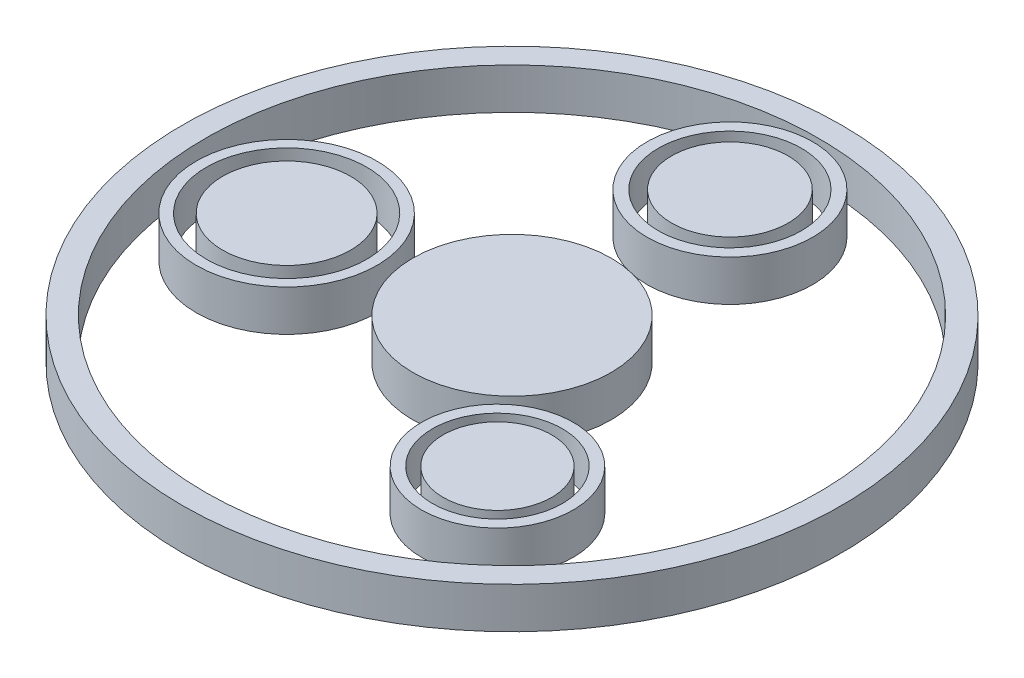
ISO-10303-21;
HEADER;
FILE_DESCRIPTION(('STEP AP214'),'2;1');
FILE_NAME('part.step','',(''),(''),'','','');
FILE_SCHEMA(('AUTOMOTIVE_DESIGN { 1 0 10303 214 1 1 1 1 }'));
ENDSEC;
DATA;
#1=APPLICATION_CONTEXT('core data for automotive mechanical design processes');
#2=APPLICATION_PROTOCOL_DEFINITION('international standard','automotive_design',2000,#1);
#3=PRODUCT_CONTEXT('',#1,'mechanical');
#4=PRODUCT('Part','Part','',(#3));
#5=PRODUCT_RELATED_PRODUCT_CATEGORY('part','',(#4));
#6=PRODUCT_DEFINITION_FORMATION('','',#4);
#7=PRODUCT_DEFINITION_CONTEXT('part definition',#1,'design');
#8=PRODUCT_DEFINITION('design','',#6,#7);
#9=PRODUCT_DEFINITION_SHAPE('','',#8);
#10=(LENGTH_UNIT() NAMED_UNIT(*) SI_UNIT(.MILLI.,.METRE.));
#11=(NAMED_UNIT(*) PLANE_ANGLE_UNIT() SI_UNIT($,.RADIAN.));
#12=(NAMED_UNIT(*) SI_UNIT($,.STERADIAN.) SOLID_ANGLE_UNIT());
#13=UNCERTAINTY_MEASURE_WITH_UNIT(LENGTH_MEASURE(1.E-05),#10,'distance_accuracy_value','');
#14=(GEOMETRIC_REPRESENTATION_CONTEXT(3) GLOBAL_UNCERTAINTY_ASSIGNED_CONTEXT((#13)) GLOBAL_UNIT_ASSIGNED_CONTEXT((#10,
#11,#12)) REPRESENTATION_CONTEXT('',''));
#15=CARTESIAN_POINT('',(0.,0.,0.));
#16=DIRECTION('',(0.,0.,1.));
#17=DIRECTION('',(1.,0.,0.));
#18=AXIS2_PLACEMENT_3D('',#15,#16,#17);
#19=CARTESIAN_POINT('',(30.0232822078429,10.,33.5714882869516));
#20=DIRECTION('',(0.,-1.,0.));
#21=DIRECTION('',(0.,0.,-1.));
#22=AXIS2_PLACEMENT_3D('',#19,#20,#21);
#23=CYLINDRICAL_SURFACE('',#22,15.8011499569246);
#24=CARTESIAN_POINT('',(30.0232822078429,10.,33.5714882869516));
#25=DIRECTION('',(0.,1.,0.));
#26=DIRECTION('',(0.,0.,1.));
#27=AXIS2_PLACEMENT_3D('',#24,#25,#26);
#28=CIRCLE('',#27,15.8011499569246);
#29=CARTESIAN_POINT('',(30.0232822078429,10.,49.3726382438762));
#30=VERTEX_POINT('',#29);
#31=EDGE_CURVE('E125',#30,#30,#28,.T.);
#32=ORIENTED_EDGE('',*,*,#31,.T.);
#33=EDGE_LOOP('',(#32));
#34=FACE_BOUND('',#33,.T.);
#35=CARTESIAN_POINT('',(30.0232822078429,0.,33.5714882869516));
#36=DIRECTION('',(0.,1.,0.));
#37=DIRECTION('',(0.,0.,1.));
#38=AXIS2_PLACEMENT_3D('',#35,#36,#37);
#39=CIRCLE('',#38,15.8011499569246);
#40=CARTESIAN_POINT('',(30.0232822078429,0.,49.3726382438762));
#41=VERTEX_POINT('',#40);
#42=EDGE_CURVE('E131',#41,#41,#39,.T.);
#43=ORIENTED_EDGE('',*,*,#42,.F.);
#44=EDGE_LOOP('',(#43));
#45=FACE_BOUND('',#44,.T.);
#46=ADVANCED_FACE('F118',(#34,#45),#23,.F.);
#47=CARTESIAN_POINT('',(30.0232822078429,10.,33.5714882869516));
#48=DIRECTION('',(0.,-1.,0.));
#49=DIRECTION('',(0.,0.,-1.));
#50=AXIS2_PLACEMENT_3D('',#47,#48,#49);
#51=CYLINDRICAL_SURFACE('',#50,18.477604897057);
#52=CARTESIAN_POINT('',(30.0232822078429,10.,33.5714882869516));
#53=DIRECTION('',(0.,1.,0.));
#54=DIRECTION('',(0.,0.,1.));
#55=AXIS2_PLACEMENT_3D('',#52,#53,#54);
#56=CIRCLE('',#55,18.477604897057);
#57=CARTESIAN_POINT('',(30.0232822078429,10.,52.0490931840086));
#58=VERTEX_POINT('',#57);
#59=EDGE_CURVE('E12',#58,#58,#56,.T.);
#60=ORIENTED_EDGE('',*,*,#59,.F.);
#61=EDGE_LOOP('',(#60));
#62=FACE_BOUND('',#61,.T.);
#63=CARTESIAN_POINT('',(30.0232822078429,0.,33.5714882869516));
#64=DIRECTION('',(0.,1.,0.));
#65=DIRECTION('',(0.,0.,1.));
#66=AXIS2_PLACEMENT_3D('',#63,#64,#65);
#67=CIRCLE('',#66,18.477604897057);
#68=CARTESIAN_POINT('',(30.0232822078429,0.,52.0490931840086));
#69=VERTEX_POINT('',#68);
#70=EDGE_CURVE('E121',#69,#69,#67,.T.);
#71=ORIENTED_EDGE('',*,*,#70,.T.);
#72=EDGE_LOOP('',(#71));
#73=FACE_BOUND('',#72,.T.);
#74=ADVANCED_FACE('F138',(#62,#73),#51,.T.);
#75=CARTESIAN_POINT('',(0.,10.,0.));
#76=DIRECTION('',(0.,1.,0.));
#77=DIRECTION('',(0.,0.,1.));
#78=AXIS2_PLACEMENT_3D('',#75,#76,#77);
#79=PLANE('',#78);
#80=ORIENTED_EDGE('',*,*,#31,.F.);
#81=EDGE_LOOP('',(#80));
#82=FACE_BOUND('',#81,.T.);
#83=ORIENTED_EDGE('',*,*,#59,.T.);
#84=EDGE_LOOP('',(#83));
#85=FACE_BOUND('',#84,.T.);
#86=ADVANCED_FACE('F142',(#82,#85),#79,.T.);
#87=CARTESIAN_POINT('',(0.,0.,0.));
#88=DIRECTION('',(0.,1.,0.));
#89=DIRECTION('',(0.,0.,1.));
#90=AXIS2_PLACEMENT_3D('',#87,#88,#89);
#91=PLANE('',#90);
#92=ORIENTED_EDGE('',*,*,#42,.T.);
#93=EDGE_LOOP('',(#92));
#94=FACE_BOUND('',#93,.T.);
#95=ORIENTED_EDGE('',*,*,#70,.F.);
#96=EDGE_LOOP('',(#95));
#97=FACE_BOUND('',#96,.T.);
#98=ADVANCED_FACE('F140',(#94,#97),#91,.F.);
#99=CLOSED_SHELL('',(#46,#74,#86,#98));
#100=MANIFOLD_SOLID_BREP('B2',#99);
#101=CARTESIAN_POINT('',(30.0232822078429,10.,33.5714882869516));
#102=DIRECTION('',(0.,-1.,0.));
#103=DIRECTION('',(0.,0.,-1.));
#104=AXIS2_PLACEMENT_3D('',#101,#102,#103);
#105=CYLINDRICAL_SURFACE('',#104,13.2030239787019);
#106=CARTESIAN_POINT('',(30.0232822078429,10.,33.5714882869516));
#107=DIRECTION('',(0.,1.,0.));
#108=DIRECTION('',(0.,0.,1.));
#109=AXIS2_PLACEMENT_3D('',#106,#107,#108);
#110=CIRCLE('',#109,13.2030239787019);
#111=CARTESIAN_POINT('',(30.0232822078429,10.,46.7745122656536));
#112=VERTEX_POINT('',#111);
#113=EDGE_CURVE('E117',#112,#112,#110,.T.);
#114=ORIENTED_EDGE('',*,*,#113,.F.);
#115=EDGE_LOOP('',(#114));
#116=FACE_BOUND('',#115,.T.);
#117=CARTESIAN_POINT('',(30.0232822078429,0.,33.5714882869516));
#118=DIRECTION('',(0.,1.,0.));
#119=DIRECTION('',(0.,0.,1.));
#120=AXIS2_PLACEMENT_3D('',#117,#118,#119);
#121=CIRCLE('',#120,13.2030239787019);
#122=CARTESIAN_POINT('',(30.0232822078429,0.,46.7745122656536));
#123=VERTEX_POINT('',#122);
#124=EDGE_CURVE('E191',#123,#123,#121,.T.);
#125=ORIENTED_EDGE('',*,*,#124,.T.);
#126=EDGE_LOOP('',(#125));
#127=FACE_BOUND('',#126,.T.);
#128=ADVANCED_FACE('F188',(#116,#127),#105,.T.);
#129=CARTESIAN_POINT('',(0.,10.,0.));
#130=DIRECTION('',(0.,1.,0.));
#131=DIRECTION('',(0.,0.,1.));
#132=AXIS2_PLACEMENT_3D('',#129,#130,#131);
#133=PLANE('',#132);
#134=ORIENTED_EDGE('',*,*,#113,.T.);
#135=EDGE_LOOP('',(#134));
#136=FACE_BOUND('',#135,.T.);
#137=ADVANCED_FACE('F203',(#136),#133,.T.);
#138=CARTESIAN_POINT('',(0.,0.,0.));
#139=DIRECTION('',(0.,1.,0.));
#140=DIRECTION('',(0.,0.,1.));
#141=AXIS2_PLACEMENT_3D('',#138,#139,#140);
#142=PLANE('',#141);
#143=ORIENTED_EDGE('',*,*,#124,.F.);
#144=EDGE_LOOP('',(#143));
#145=FACE_BOUND('',#144,.T.);
#146=ADVANCED_FACE('F201',(#145),#142,.F.);
#147=CLOSED_SHELL('',(#128,#137,#146));
#148=MANIFOLD_SOLID_BREP('B7',#147);
#149=CARTESIAN_POINT('',(0.,10.,-53.0411319005225));
#150=DIRECTION('',(0.,-1.,0.));
#151=DIRECTION('',(0.,0.,-1.));
#152=AXIS2_PLACEMENT_3D('',#149,#150,#151);
#153=CYLINDRICAL_SURFACE('',#152,17.4158897125243);
#154=CARTESIAN_POINT('',(0.,10.,-53.0411319005225));
#155=DIRECTION('',(0.,1.,0.));
#156=DIRECTION('',(0.,0.,1.));
#157=AXIS2_PLACEMENT_3D('',#154,#155,#156);
#158=CIRCLE('',#157,17.4158897125243);
#159=CARTESIAN_POINT('',(0.,10.,-35.6252421879982));
#160=VERTEX_POINT('',#159);
#161=EDGE_CURVE('E244',#160,#160,#158,.T.);
#162=ORIENTED_EDGE('',*,*,#161,.T.);
#163=EDGE_LOOP('',(#162));
#164=FACE_BOUND('',#163,.T.);
#165=CARTESIAN_POINT('',(0.,0.,-53.0411319005225));
#166=DIRECTION('',(0.,1.,0.));
#167=DIRECTION('',(0.,0.,1.));
#168=AXIS2_PLACEMENT_3D('',#165,#166,#167);
#169=CIRCLE('',#168,17.4158897125243);
#170=CARTESIAN_POINT('',(0.,0.,-35.6252421879982));
#171=VERTEX_POINT('',#170);
#172=EDGE_CURVE('E250',#171,#171,#169,.T.);
#173=ORIENTED_EDGE('',*,*,#172,.F.);
#174=EDGE_LOOP('',(#173));
#175=FACE_BOUND('',#174,.T.);
#176=ADVANCED_FACE('F237',(#164,#175),#153,.F.);
#177=CARTESIAN_POINT('',(0.,10.,-53.0411319005225));
#178=DIRECTION('',(0.,-1.,0.));
#179=DIRECTION('',(0.,0.,-1.));
#180=AXIS2_PLACEMENT_3D('',#177,#178,#179);
#181=CYLINDRICAL_SURFACE('',#180,20.1523503336674);
#182=CARTESIAN_POINT('',(0.,10.,-53.0411319005225));
#183=DIRECTION('',(0.,1.,0.));
#184=DIRECTION('',(0.,0.,1.));
#185=AXIS2_PLACEMENT_3D('',#182,#183,#184);
#186=CIRCLE('',#185,20.1523503336674);
#187=CARTESIAN_POINT('',(0.,10.,-32.8887815668551));
#188=VERTEX_POINT('',#187);
#189=EDGE_CURVE('E187',#188,#188,#186,.T.);
#190=ORIENTED_EDGE('',*,*,#189,.F.);
#191=EDGE_LOOP('',(#190));
#192=FACE_BOUND('',#191,.T.);
#193=CARTESIAN_POINT('',(0.,0.,-53.0411319005225));
#194=DIRECTION('',(0.,1.,0.));
#195=DIRECTION('',(0.,0.,1.));
#196=AXIS2_PLACEMENT_3D('',#193,#194,#195);
#197=CIRCLE('',#196,20.1523503336674);
#198=CARTESIAN_POINT('',(0.,0.,-32.8887815668551));
#199=VERTEX_POINT('',#198);
#200=EDGE_CURVE('E240',#199,#199,#197,.T.);
#201=ORIENTED_EDGE('',*,*,#200,.T.);
#202=EDGE_LOOP('',(#201));
#203=FACE_BOUND('',#202,.T.);
#204=ADVANCED_FACE('F257',(#192,#203),#181,.T.);
#205=CARTESIAN_POINT('',(0.,10.,0.));
#206=DIRECTION('',(0.,1.,0.));
#207=DIRECTION('',(0.,0.,1.));
#208=AXIS2_PLACEMENT_3D('',#205,#206,#207);
#209=PLANE('',#208);
#210=ORIENTED_EDGE('',*,*,#161,.F.);
#211=EDGE_LOOP('',(#210));
#212=FACE_BOUND('',#211,.T.);
#213=ORIENTED_EDGE('',*,*,#189,.T.);
#214=EDGE_LOOP('',(#213));
#215=FACE_BOUND('',#214,.T.);
#216=ADVANCED_FACE('F261',(#212,#215),#209,.T.);
#217=CARTESIAN_POINT('',(0.,0.,0.));
#218=DIRECTION('',(0.,1.,0.));
#219=DIRECTION('',(0.,0.,1.));
#220=AXIS2_PLACEMENT_3D('',#217,#218,#219);
#221=PLANE('',#220);
#222=ORIENTED_EDGE('',*,*,#172,.T.);
#223=EDGE_LOOP('',(#222));
#224=FACE_BOUND('',#223,.T.);
#225=ORIENTED_EDGE('',*,*,#200,.F.);
#226=EDGE_LOOP('',(#225));
#227=FACE_BOUND('',#226,.T.);
#228=ADVANCED_FACE('F259',(#224,#227),#221,.F.);
#229=CLOSED_SHELL('',(#176,#204,#216,#228));
#230=MANIFOLD_SOLID_BREP('B112',#229);
#231=CARTESIAN_POINT('',(0.,10.,-53.0411319005225));
#232=DIRECTION('',(0.,-1.,0.));
#233=DIRECTION('',(0.,0.,-1.));
#234=AXIS2_PLACEMENT_3D('',#231,#232,#233);
#235=CYLINDRICAL_SURFACE('',#234,14.1811554627673);
#236=CARTESIAN_POINT('',(0.,10.,-53.0411319005225));
#237=DIRECTION('',(0.,1.,0.));
#238=DIRECTION('',(0.,0.,1.));
#239=AXIS2_PLACEMENT_3D('',#236,#237,#238);
#240=CIRCLE('',#239,14.1811554627673);
#241=CARTESIAN_POINT('',(0.,10.,-38.8599764377552));
#242=VERTEX_POINT('',#241);
#243=EDGE_CURVE('E236',#242,#242,#240,.T.);
#244=ORIENTED_EDGE('',*,*,#243,.F.);
#245=EDGE_LOOP('',(#244));
#246=FACE_BOUND('',#245,.T.);
#247=CARTESIAN_POINT('',(0.,0.,-53.0411319005225));
#248=DIRECTION('',(0.,1.,0.));
#249=DIRECTION('',(0.,0.,1.));
#250=AXIS2_PLACEMENT_3D('',#247,#248,#249);
#251=CIRCLE('',#250,14.1811554627673);
#252=CARTESIAN_POINT('',(0.,0.,-38.8599764377552));
#253=VERTEX_POINT('',#252);
#254=EDGE_CURVE('E310',#253,#253,#251,.T.);
#255=ORIENTED_EDGE('',*,*,#254,.T.);
#256=EDGE_LOOP('',(#255));
#257=FACE_BOUND('',#256,.T.);
#258=ADVANCED_FACE('F307',(#246,#257),#235,.T.);
#259=CARTESIAN_POINT('',(0.,10.,0.));
#260=DIRECTION('',(0.,1.,0.));
#261=DIRECTION('',(0.,0.,1.));
#262=AXIS2_PLACEMENT_3D('',#259,#260,#261);
#263=PLANE('',#262);
#264=ORIENTED_EDGE('',*,*,#243,.T.);
#265=EDGE_LOOP('',(#264));
#266=FACE_BOUND('',#265,.T.);
#267=ADVANCED_FACE('F322',(#266),#263,.T.);
#268=CARTESIAN_POINT('',(0.,0.,0.));
#269=DIRECTION('',(0.,1.,0.));
#270=DIRECTION('',(0.,0.,1.));
#271=AXIS2_PLACEMENT_3D('',#268,#269,#270);
#272=PLANE('',#271);
#273=ORIENTED_EDGE('',*,*,#254,.F.);
#274=EDGE_LOOP('',(#273));
#275=FACE_BOUND('',#274,.T.);
#276=ADVANCED_FACE('F320',(#275),#272,.F.);
#277=CLOSED_SHELL('',(#258,#267,#276));
#278=MANIFOLD_SOLID_BREP('B182',#277);
#279=CARTESIAN_POINT('',(-48.9470479630894,10.,5.91367679851451));
#280=DIRECTION('',(0.,-1.,0.));
#281=DIRECTION('',(0.,0.,-1.));
#282=AXIS2_PLACEMENT_3D('',#279,#280,#281);
#283=CYLINDRICAL_SURFACE('',#282,19.4798442658321);
#284=CARTESIAN_POINT('',(-48.9470479630894,10.,5.91367679851451));
#285=DIRECTION('',(0.,1.,0.));
#286=DIRECTION('',(0.,0.,1.));
#287=AXIS2_PLACEMENT_3D('',#284,#285,#286);
#288=CIRCLE('',#287,19.4798442658321);
#289=CARTESIAN_POINT('',(-48.9470479630894,10.,25.3935210643466));
#290=VERTEX_POINT('',#289);
#291=EDGE_CURVE('E363',#290,#290,#288,.T.);
#292=ORIENTED_EDGE('',*,*,#291,.T.);
#293=EDGE_LOOP('',(#292));
#294=FACE_BOUND('',#293,.T.);
#295=CARTESIAN_POINT('',(-48.9470479630894,0.,5.91367679851451));
#296=DIRECTION('',(0.,1.,0.));
#297=DIRECTION('',(0.,0.,1.));
#298=AXIS2_PLACEMENT_3D('',#295,#296,#297);
#299=CIRCLE('',#298,19.4798442658321);
#300=CARTESIAN_POINT('',(-48.9470479630894,0.,25.3935210643466));
#301=VERTEX_POINT('',#300);
#302=EDGE_CURVE('E369',#301,#301,#299,.T.);
#303=ORIENTED_EDGE('',*,*,#302,.F.);
#304=EDGE_LOOP('',(#303));
#305=FACE_BOUND('',#304,.T.);
#306=ADVANCED_FACE('F356',(#294,#305),#283,.F.);
#307=CARTESIAN_POINT('',(-48.9470479630894,10.,5.91367679851451));
#308=DIRECTION('',(0.,-1.,0.));
#309=DIRECTION('',(0.,0.,-1.));
#310=AXIS2_PLACEMENT_3D('',#307,#308,#309);
#311=CYLINDRICAL_SURFACE('',#310,22.0020305224809);
#312=CARTESIAN_POINT('',(-48.9470479630894,10.,5.91367679851451));
#313=DIRECTION('',(0.,1.,0.));
#314=DIRECTION('',(0.,0.,1.));
#315=AXIS2_PLACEMENT_3D('',#312,#313,#314);
#316=CIRCLE('',#315,22.0020305224809);
#317=CARTESIAN_POINT('',(-48.9470479630894,10.,27.9157073209954));
#318=VERTEX_POINT('',#317);
#319=EDGE_CURVE('E306',#318,#318,#316,.T.);
#320=ORIENTED_EDGE('',*,*,#319,.F.);
#321=EDGE_LOOP('',(#320));
#322=FACE_BOUND('',#321,.T.);
#323=CARTESIAN_POINT('',(-48.9470479630894,0.,5.91367679851451));
#324=DIRECTION('',(0.,1.,0.));
#325=DIRECTION('',(0.,0.,1.));
#326=AXIS2_PLACEMENT_3D('',#323,#324,#325);
#327=CIRCLE('',#326,22.0020305224809);
#328=CARTESIAN_POINT('',(-48.9470479630894,0.,27.9157073209954));
#329=VERTEX_POINT('',#328);
#330=EDGE_CURVE('E359',#329,#329,#327,.T.);
#331=ORIENTED_EDGE('',*,*,#330,.T.);
#332=EDGE_LOOP('',(#331));
#333=FACE_BOUND('',#332,.T.);
#334=ADVANCED_FACE('F376',(#322,#333),#311,.T.);
#335=CARTESIAN_POINT('',(0.,10.,0.));
#336=DIRECTION('',(0.,1.,0.));
#337=DIRECTION('',(0.,0.,1.));
#338=AXIS2_PLACEMENT_3D('',#335,#336,#337);
#339=PLANE('',#338);
#340=ORIENTED_EDGE('',*,*,#291,.F.);
#341=EDGE_LOOP('',(#340));
#342=FACE_BOUND('',#341,.T.);
#343=ORIENTED_EDGE('',*,*,#319,.T.);
#344=EDGE_LOOP('',(#343));
#345=FACE_BOUND('',#344,.T.);
#346=ADVANCED_FACE('F380',(#342,#345),#339,.T.);
#347=CARTESIAN_POINT('',(0.,0.,0.));
#348=DIRECTION('',(0.,1.,0.));
#349=DIRECTION('',(0.,0.,1.));
#350=AXIS2_PLACEMENT_3D('',#347,#348,#349);
#351=PLANE('',#350);
#352=ORIENTED_EDGE('',*,*,#302,.T.);
#353=EDGE_LOOP('',(#352));
#354=FACE_BOUND('',#353,.T.);
#355=ORIENTED_EDGE('',*,*,#330,.F.);
#356=EDGE_LOOP('',(#355));
#357=FACE_BOUND('',#356,.T.);
#358=ADVANCED_FACE('F378',(#354,#357),#351,.F.);
#359=CLOSED_SHELL('',(#306,#334,#346,#358));
#360=MANIFOLD_SOLID_BREP('B231',#359);
#361=CARTESIAN_POINT('',(-48.9470479630894,10.,5.91367679851451));
#362=DIRECTION('',(0.,-1.,0.));
#363=DIRECTION('',(0.,0.,-1.));
#364=AXIS2_PLACEMENT_3D('',#361,#362,#363);
#365=CYLINDRICAL_SURFACE('',#364,15.5763950976343);
#366=CARTESIAN_POINT('',(-48.9470479630894,10.,5.91367679851451));
#367=DIRECTION('',(0.,1.,0.));
#368=DIRECTION('',(0.,0.,1.));
#369=AXIS2_PLACEMENT_3D('',#366,#367,#368);
#370=CIRCLE('',#369,15.5763950976343);
#371=CARTESIAN_POINT('',(-48.9470479630894,10.,21.4900718961488));
#372=VERTEX_POINT('',#371);
#373=EDGE_CURVE('E355',#372,#372,#370,.T.);
#374=ORIENTED_EDGE('',*,*,#373,.F.);
#375=EDGE_LOOP('',(#374));
#376=FACE_BOUND('',#375,.T.);
#377=CARTESIAN_POINT('',(-48.9470479630894,0.,5.91367679851451));
#378=DIRECTION('',(0.,1.,0.));
#379=DIRECTION('',(0.,0.,1.));
#380=AXIS2_PLACEMENT_3D('',#377,#378,#379);
#381=CIRCLE('',#380,15.5763950976343);
#382=CARTESIAN_POINT('',(-48.9470479630894,0.,21.4900718961488));
#383=VERTEX_POINT('',#382);
#384=EDGE_CURVE('E429',#383,#383,#381,.T.);
#385=ORIENTED_EDGE('',*,*,#384,.T.);
#386=EDGE_LOOP('',(#385));
#387=FACE_BOUND('',#386,.T.);
#388=ADVANCED_FACE('F426',(#376,#387),#365,.T.);
#389=CARTESIAN_POINT('',(0.,10.,0.));
#390=DIRECTION('',(0.,1.,0.));
#391=DIRECTION('',(0.,0.,1.));
#392=AXIS2_PLACEMENT_3D('',#389,#390,#391);
#393=PLANE('',#392);
#394=ORIENTED_EDGE('',*,*,#373,.T.);
#395=EDGE_LOOP('',(#394));
#396=FACE_BOUND('',#395,.T.);
#397=ADVANCED_FACE('F441',(#396),#393,.T.);
#398=CARTESIAN_POINT('',(0.,0.,0.));
#399=DIRECTION('',(0.,1.,0.));
#400=DIRECTION('',(0.,0.,1.));
#401=AXIS2_PLACEMENT_3D('',#398,#399,#400);
#402=PLANE('',#401);
#403=ORIENTED_EDGE('',*,*,#384,.F.);
#404=EDGE_LOOP('',(#403));
#405=FACE_BOUND('',#404,.T.);
#406=ADVANCED_FACE('F439',(#405),#402,.F.);
#407=CLOSED_SHELL('',(#388,#397,#406));
#408=MANIFOLD_SOLID_BREP('B301',#407);
#409=CARTESIAN_POINT('',(0.,10.,0.));
#410=DIRECTION('',(0.,-1.,0.));
#411=DIRECTION('',(0.,0.,-1.));
#412=AXIS2_PLACEMENT_3D('',#409,#410,#411);
#413=CYLINDRICAL_SURFACE('',#412,24.1349976739206);
#414=CARTESIAN_POINT('',(0.,10.,0.));
#415=DIRECTION('',(0.,1.,0.));
#416=DIRECTION('',(0.,0.,1.));
#417=AXIS2_PLACEMENT_3D('',#414,#415,#416);
#418=CIRCLE('',#417,24.1349976739206);
#419=CARTESIAN_POINT('',(0.,10.,24.1349976739206));
#420=VERTEX_POINT('',#419);
#421=EDGE_CURVE('E425',#420,#420,#418,.T.);
#422=ORIENTED_EDGE('',*,*,#421,.F.);
#423=EDGE_LOOP('',(#422));
#424=FACE_BOUND('',#423,.T.);
#425=CARTESIAN_POINT('',(0.,0.,0.));
#426=DIRECTION('',(0.,1.,0.));
#427=DIRECTION('',(0.,0.,1.));
#428=AXIS2_PLACEMENT_3D('',#425,#426,#427);
#429=CIRCLE('',#428,24.1349976739206);
#430=CARTESIAN_POINT('',(0.,0.,24.1349976739206));
#431=VERTEX_POINT('',#430);
#432=EDGE_CURVE('E477',#431,#431,#429,.T.);
#433=ORIENTED_EDGE('',*,*,#432,.T.);
#434=EDGE_LOOP('',(#433));
#435=FACE_BOUND('',#434,.T.);
#436=ADVANCED_FACE('F474',(#424,#435),#413,.T.);
#437=CARTESIAN_POINT('',(0.,10.,0.));
#438=DIRECTION('',(0.,1.,0.));
#439=DIRECTION('',(0.,0.,1.));
#440=AXIS2_PLACEMENT_3D('',#437,#438,#439);
#441=PLANE('',#440);
#442=ORIENTED_EDGE('',*,*,#421,.T.);
#443=EDGE_LOOP('',(#442));
#444=FACE_BOUND('',#443,.T.);
#445=ADVANCED_FACE('F489',(#444),#441,.T.);
#446=CARTESIAN_POINT('',(0.,0.,0.));
#447=DIRECTION('',(0.,1.,0.));
#448=DIRECTION('',(0.,0.,1.));
#449=AXIS2_PLACEMENT_3D('',#446,#447,#448);
#450=PLANE('',#449);
#451=ORIENTED_EDGE('',*,*,#432,.F.);
#452=EDGE_LOOP('',(#451));
#453=FACE_BOUND('',#452,.T.);
#454=ADVANCED_FACE('F487',(#453),#450,.F.);
#455=CLOSED_SHELL('',(#436,#445,#454));
#456=MANIFOLD_SOLID_BREP('B350',#455);
#457=CARTESIAN_POINT('',(0.,10.,0.));
#458=DIRECTION('',(0.,-1.,0.));
#459=DIRECTION('',(0.,0.,-1.));
#460=AXIS2_PLACEMENT_3D('',#457,#458,#459);
#461=CYLINDRICAL_SURFACE('',#460,74.6426289945602);
#462=CARTESIAN_POINT('',(0.,10.,0.));
#463=DIRECTION('',(0.,1.,0.));
#464=DIRECTION('',(0.,0.,1.));
#465=AXIS2_PLACEMENT_3D('',#462,#463,#464);
#466=CIRCLE('',#465,74.6426289945602);
#467=CARTESIAN_POINT('',(0.,10.,74.6426289945602));
#468=VERTEX_POINT('',#467);
#469=EDGE_CURVE('E523',#468,#468,#466,.T.);
#470=ORIENTED_EDGE('',*,*,#469,.T.);
#471=EDGE_LOOP('',(#470));
#472=FACE_BOUND('',#471,.T.);
#473=CARTESIAN_POINT('',(0.,0.,0.));
#474=DIRECTION('',(0.,1.,0.));
#475=DIRECTION('',(0.,0.,1.));
#476=AXIS2_PLACEMENT_3D('',#473,#474,#475);
#477=CIRCLE('',#476,74.6426289945602);
#478=CARTESIAN_POINT('',(0.,0.,74.6426289945602));
#479=VERTEX_POINT('',#478);
#480=EDGE_CURVE('E530',#479,#479,#477,.T.);
#481=ORIENTED_EDGE('',*,*,#480,.F.);
#482=EDGE_LOOP('',(#481));
#483=FACE_BOUND('',#482,.T.);
#484=ADVANCED_FACE('F515',(#472,#483),#461,.F.);
#485=CARTESIAN_POINT('',(0.,10.,0.));
#486=DIRECTION('',(0.,-1.,0.));
#487=DIRECTION('',(0.,0.,-1.));
#488=AXIS2_PLACEMENT_3D('',#485,#486,#487);
#489=CYLINDRICAL_SURFACE('',#488,80.2226383773634);
#490=CARTESIAN_POINT('',(0.,10.,0.));
#491=DIRECTION('',(0.,1.,0.));
#492=DIRECTION('',(0.,0.,1.));
#493=AXIS2_PLACEMENT_3D('',#490,#491,#492);
#494=CIRCLE('',#493,80.2226383773634);
#495=CARTESIAN_POINT('',(0.,10.,80.2226383773634));
#496=VERTEX_POINT('',#495);
#497=EDGE_CURVE('E473',#496,#496,#494,.T.);
#498=ORIENTED_EDGE('',*,*,#497,.F.);
#499=EDGE_LOOP('',(#498));
#500=FACE_BOUND('',#499,.T.);
#501=CARTESIAN_POINT('',(0.,0.,0.));
#502=DIRECTION('',(0.,1.,0.));
#503=DIRECTION('',(0.,0.,1.));
#504=AXIS2_PLACEMENT_3D('',#501,#502,#503);
#505=CIRCLE('',#504,80.2226383773634);
#506=CARTESIAN_POINT('',(0.,0.,80.2226383773634));
#507=VERTEX_POINT('',#506);
#508=EDGE_CURVE('E518',#507,#507,#505,.T.);
#509=ORIENTED_EDGE('',*,*,#508,.T.);
#510=EDGE_LOOP('',(#509));
#511=FACE_BOUND('',#510,.T.);
#512=ADVANCED_FACE('F539',(#500,#511),#489,.T.);
#513=CARTESIAN_POINT('',(0.,10.,0.));
#514=DIRECTION('',(0.,1.,0.));
#515=DIRECTION('',(0.,0.,1.));
#516=AXIS2_PLACEMENT_3D('',#513,#514,#515);
#517=PLANE('',#516);
#518=ORIENTED_EDGE('',*,*,#469,.F.);
#519=EDGE_LOOP('',(#518));
#520=FACE_BOUND('',#519,.T.);
#521=ORIENTED_EDGE('',*,*,#497,.T.);
#522=EDGE_LOOP('',(#521));
#523=FACE_BOUND('',#522,.T.);
#524=ADVANCED_FACE('F543',(#520,#523),#517,.T.);
#525=CARTESIAN_POINT('',(0.,0.,0.));
#526=DIRECTION('',(0.,1.,0.));
#527=DIRECTION('',(0.,0.,1.));
#528=AXIS2_PLACEMENT_3D('',#525,#526,#527);
#529=PLANE('',#528);
#530=ORIENTED_EDGE('',*,*,#480,.T.);
#531=EDGE_LOOP('',(#530));
#532=FACE_BOUND('',#531,.T.);
#533=ORIENTED_EDGE('',*,*,#508,.F.);
#534=EDGE_LOOP('',(#533));
#535=FACE_BOUND('',#534,.T.);
#536=ADVANCED_FACE('F541',(#532,#535),#529,.F.);
#537=CLOSED_SHELL('',(#484,#512,#524,#536));
#538=MANIFOLD_SOLID_BREP('B420',#537);
#539=ADVANCED_BREP_SHAPE_REPRESENTATION('',(#18,#100,#148,#230,#278,#360,#408,#456,#538),#14);
#540=SHAPE_DEFINITION_REPRESENTATION(#9,#539);
ENDSEC;
END-ISO-10303-21;
